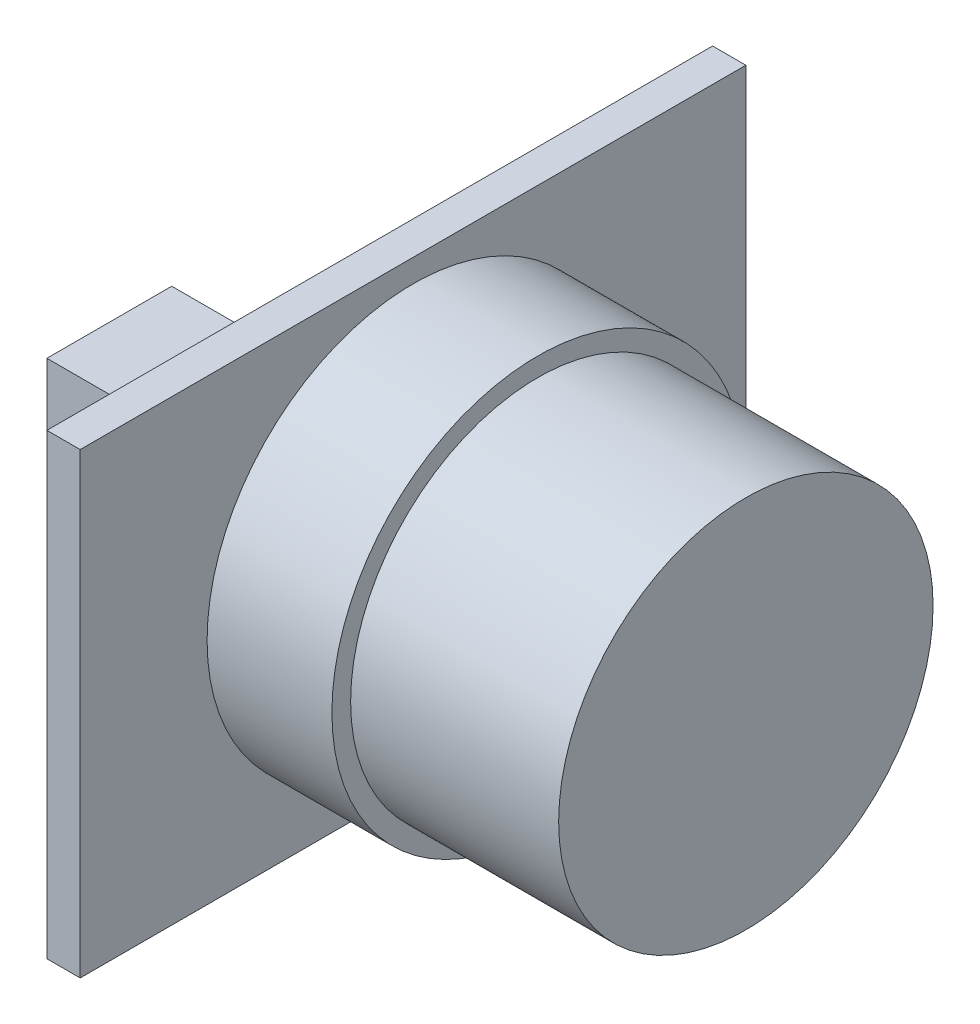
ISO-10303-21;
HEADER;
FILE_DESCRIPTION(('STEP AP214'),'2;1');
FILE_NAME('part.step','',(''),(''),'','','');
FILE_SCHEMA(('AUTOMOTIVE_DESIGN { 1 0 10303 214 1 1 1 1 }'));
ENDSEC;
DATA;
#1=APPLICATION_CONTEXT('core data for automotive mechanical design processes');
#2=APPLICATION_PROTOCOL_DEFINITION('international standard','automotive_design',2000,#1);
#3=PRODUCT_CONTEXT('',#1,'mechanical');
#4=PRODUCT('Part','Part','',(#3));
#5=PRODUCT_RELATED_PRODUCT_CATEGORY('part','',(#4));
#6=PRODUCT_DEFINITION_FORMATION('','',#4);
#7=PRODUCT_DEFINITION_CONTEXT('part definition',#1,'design');
#8=PRODUCT_DEFINITION('design','',#6,#7);
#9=PRODUCT_DEFINITION_SHAPE('','',#8);
#10=(LENGTH_UNIT() NAMED_UNIT(*) SI_UNIT(.MILLI.,.METRE.));
#11=(NAMED_UNIT(*) PLANE_ANGLE_UNIT() SI_UNIT($,.RADIAN.));
#12=(NAMED_UNIT(*) SI_UNIT($,.STERADIAN.) SOLID_ANGLE_UNIT());
#13=UNCERTAINTY_MEASURE_WITH_UNIT(LENGTH_MEASURE(1.E-05),#10,'distance_accuracy_value','');
#14=(GEOMETRIC_REPRESENTATION_CONTEXT(3) GLOBAL_UNCERTAINTY_ASSIGNED_CONTEXT((#13)) GLOBAL_UNIT_ASSIGNED_CONTEXT((#10,
#11,#12)) REPRESENTATION_CONTEXT('',''));
#15=CARTESIAN_POINT('',(0.,0.,0.));
#16=DIRECTION('',(0.,0.,1.));
#17=DIRECTION('',(1.,0.,0.));
#18=AXIS2_PLACEMENT_3D('',#15,#16,#17);
#19=CARTESIAN_POINT('',(29.2,-132.5,41.));
#20=DIRECTION('',(1.,0.,0.));
#21=DIRECTION('',(0.,0.,-1.));
#22=AXIS2_PLACEMENT_3D('',#19,#20,#21);
#23=PLANE('',#22);
#24=DIRECTION('',(0.,-1.,0.));
#25=VECTOR('',#24,1.);
#26=CARTESIAN_POINT('',(29.2,-132.5,9.));
#27=LINE('',#26,#25);
#28=CARTESIAN_POINT('',(29.2,-110.5,9.));
#29=VERTEX_POINT('',#28);
#30=CARTESIAN_POINT('',(29.2,-132.5,9.));
#31=VERTEX_POINT('',#30);
#32=EDGE_CURVE('E161',#29,#31,#27,.T.);
#33=ORIENTED_EDGE('',*,*,#32,.T.);
#34=DIRECTION('',(0.,0.,-1.));
#35=VECTOR('',#34,1.);
#36=CARTESIAN_POINT('',(29.2,-132.5,41.));
#37=LINE('',#36,#35);
#38=CARTESIAN_POINT('',(29.2,-132.5,41.));
#39=VERTEX_POINT('',#38);
#40=EDGE_CURVE('E165',#39,#31,#37,.T.);
#41=ORIENTED_EDGE('',*,*,#40,.F.);
#42=DIRECTION('',(0.,-1.,0.));
#43=VECTOR('',#42,1.);
#44=CARTESIAN_POINT('',(29.2,-132.5,41.));
#45=LINE('',#44,#43);
#46=CARTESIAN_POINT('',(29.2,-110.5,41.));
#47=VERTEX_POINT('',#46);
#48=EDGE_CURVE('E153',#47,#39,#45,.T.);
#49=ORIENTED_EDGE('',*,*,#48,.F.);
#50=DIRECTION('',(0.,0.,-1.));
#51=VECTOR('',#50,1.);
#52=CARTESIAN_POINT('',(29.2,-110.5,41.));
#53=LINE('',#52,#51);
#54=EDGE_CURVE('E166',#47,#29,#53,.T.);
#55=ORIENTED_EDGE('',*,*,#54,.T.);
#56=EDGE_LOOP('',(#33,#41,#49,#55));
#57=FACE_BOUND('',#56,.T.);
#58=DIRECTION('',(0.,1.,0.));
#59=VECTOR('',#58,1.);
#60=CARTESIAN_POINT('',(29.2,-119.5,35.));
#61=LINE('',#60,#59);
#62=CARTESIAN_POINT('',(29.2,-119.5,35.));
#63=VERTEX_POINT('',#62);
#64=CARTESIAN_POINT('',(29.2,-113.5,35.));
#65=VERTEX_POINT('',#64);
#66=EDGE_CURVE('E122',#63,#65,#61,.T.);
#67=ORIENTED_EDGE('',*,*,#66,.F.);
#68=DIRECTION('',(0.,0.,-1.));
#69=VECTOR('',#68,1.);
#70=CARTESIAN_POINT('',(29.2,-119.5,35.));
#71=LINE('',#70,#69);
#72=CARTESIAN_POINT('',(29.2,-119.5,29.));
#73=VERTEX_POINT('',#72);
#74=EDGE_CURVE('E381',#63,#73,#71,.T.);
#75=ORIENTED_EDGE('',*,*,#74,.T.);
#76=DIRECTION('',(0.,1.,0.));
#77=VECTOR('',#76,1.);
#78=CARTESIAN_POINT('',(29.2,-119.5,29.));
#79=LINE('',#78,#77);
#80=CARTESIAN_POINT('',(29.2,-113.5,29.));
#81=VERTEX_POINT('',#80);
#82=EDGE_CURVE('E135',#73,#81,#79,.T.);
#83=ORIENTED_EDGE('',*,*,#82,.T.);
#84=DIRECTION('',(0.,0.,-1.));
#85=VECTOR('',#84,1.);
#86=CARTESIAN_POINT('',(29.2,-113.5,35.));
#87=LINE('',#86,#85);
#88=EDGE_CURVE('E56',#65,#81,#87,.T.);
#89=ORIENTED_EDGE('',*,*,#88,.F.);
#90=EDGE_LOOP('',(#67,#75,#83,#89));
#91=FACE_BOUND('',#90,.T.);
#92=ADVANCED_FACE('F39',(#57,#91),#23,.F.);
#93=CARTESIAN_POINT('',(30.8,-132.5,41.));
#94=DIRECTION('',(-1.,0.,0.));
#95=DIRECTION('',(0.,0.,1.));
#96=AXIS2_PLACEMENT_3D('',#93,#94,#95);
#97=PLANE('',#96);
#98=CARTESIAN_POINT('',(30.8,-121.5,25.));
#99=DIRECTION('',(1.,0.,0.));
#100=DIRECTION('',(0.,0.,-1.));
#101=AXIS2_PLACEMENT_3D('',#98,#99,#100);
#102=CIRCLE('',#101,9.9);
#103=CARTESIAN_POINT('',(30.8,-121.5,15.1));
#104=VERTEX_POINT('',#103);
#105=EDGE_CURVE('E48',#104,#104,#102,.T.);
#106=ORIENTED_EDGE('',*,*,#105,.F.);
#107=EDGE_LOOP('',(#106));
#108=FACE_BOUND('',#107,.T.);
#109=DIRECTION('',(0.,1.,0.));
#110=VECTOR('',#109,1.);
#111=CARTESIAN_POINT('',(30.8,-132.5,9.));
#112=LINE('',#111,#110);
#113=CARTESIAN_POINT('',(30.8,-132.5,9.));
#114=VERTEX_POINT('',#113);
#115=CARTESIAN_POINT('',(30.8,-110.5,9.));
#116=VERTEX_POINT('',#115);
#117=EDGE_CURVE('E147',#114,#116,#112,.T.);
#118=ORIENTED_EDGE('',*,*,#117,.T.);
#119=DIRECTION('',(0.,0.,-1.));
#120=VECTOR('',#119,1.);
#121=CARTESIAN_POINT('',(30.8,-110.5,41.));
#122=LINE('',#121,#120);
#123=CARTESIAN_POINT('',(30.8,-110.5,41.));
#124=VERTEX_POINT('',#123);
#125=EDGE_CURVE('E43',#124,#116,#122,.T.);
#126=ORIENTED_EDGE('',*,*,#125,.F.);
#127=DIRECTION('',(0.,1.,0.));
#128=VECTOR('',#127,1.);
#129=CARTESIAN_POINT('',(30.8,-132.5,41.));
#130=LINE('',#129,#128);
#131=CARTESIAN_POINT('',(30.8,-132.5,41.));
#132=VERTEX_POINT('',#131);
#133=EDGE_CURVE('E150',#132,#124,#130,.T.);
#134=ORIENTED_EDGE('',*,*,#133,.F.);
#135=DIRECTION('',(0.,0.,-1.));
#136=VECTOR('',#135,1.);
#137=CARTESIAN_POINT('',(30.8,-132.5,41.));
#138=LINE('',#137,#136);
#139=EDGE_CURVE('E156',#132,#114,#138,.T.);
#140=ORIENTED_EDGE('',*,*,#139,.T.);
#141=EDGE_LOOP('',(#118,#126,#134,#140));
#142=FACE_BOUND('',#141,.T.);
#143=ADVANCED_FACE('F41',(#108,#142),#97,.F.);
#144=CARTESIAN_POINT('',(29.2,-110.5,41.));
#145=DIRECTION('',(0.,-1.,0.));
#146=DIRECTION('',(0.,0.,-1.));
#147=AXIS2_PLACEMENT_3D('',#144,#145,#146);
#148=PLANE('',#147);
#149=DIRECTION('',(-1.,0.,0.));
#150=VECTOR('',#149,1.);
#151=CARTESIAN_POINT('',(29.2,-110.5,9.));
#152=LINE('',#151,#150);
#153=EDGE_CURVE('E159',#116,#29,#152,.T.);
#154=ORIENTED_EDGE('',*,*,#153,.T.);
#155=ORIENTED_EDGE('',*,*,#54,.F.);
#156=DIRECTION('',(-1.,0.,0.));
#157=VECTOR('',#156,1.);
#158=CARTESIAN_POINT('',(29.2,-110.5,41.));
#159=LINE('',#158,#157);
#160=EDGE_CURVE('E94',#124,#47,#159,.T.);
#161=ORIENTED_EDGE('',*,*,#160,.F.);
#162=ORIENTED_EDGE('',*,*,#125,.T.);
#163=EDGE_LOOP('',(#154,#155,#161,#162));
#164=FACE_BOUND('',#163,.T.);
#165=ADVANCED_FACE('F172',(#164),#148,.F.);
#166=CARTESIAN_POINT('',(29.2,-132.5,41.));
#167=DIRECTION('',(0.,1.,0.));
#168=DIRECTION('',(0.,0.,1.));
#169=AXIS2_PLACEMENT_3D('',#166,#167,#168);
#170=PLANE('',#169);
#171=DIRECTION('',(1.,0.,0.));
#172=VECTOR('',#171,1.);
#173=CARTESIAN_POINT('',(29.2,-132.5,9.));
#174=LINE('',#173,#172);
#175=EDGE_CURVE('E86',#31,#114,#174,.T.);
#176=ORIENTED_EDGE('',*,*,#175,.T.);
#177=ORIENTED_EDGE('',*,*,#139,.F.);
#178=DIRECTION('',(1.,0.,0.));
#179=VECTOR('',#178,1.);
#180=CARTESIAN_POINT('',(29.2,-132.5,41.));
#181=LINE('',#180,#179);
#182=EDGE_CURVE('E65',#39,#132,#181,.T.);
#183=ORIENTED_EDGE('',*,*,#182,.F.);
#184=ORIENTED_EDGE('',*,*,#40,.T.);
#185=EDGE_LOOP('',(#176,#177,#183,#184));
#186=FACE_BOUND('',#185,.T.);
#187=ADVANCED_FACE('F179',(#186),#170,.F.);
#188=CARTESIAN_POINT('',(0.,0.,41.));
#189=DIRECTION('',(0.,0.,-1.));
#190=DIRECTION('',(-1.,0.,0.));
#191=AXIS2_PLACEMENT_3D('',#188,#189,#190);
#192=PLANE('',#191);
#193=ORIENTED_EDGE('',*,*,#133,.T.);
#194=ORIENTED_EDGE('',*,*,#160,.T.);
#195=ORIENTED_EDGE('',*,*,#48,.T.);
#196=ORIENTED_EDGE('',*,*,#182,.T.);
#197=EDGE_LOOP('',(#193,#194,#195,#196));
#198=FACE_BOUND('',#197,.T.);
#199=ADVANCED_FACE('F180',(#198),#192,.F.);
#200=CARTESIAN_POINT('',(0.,0.,9.));
#201=DIRECTION('',(0.,0.,-1.));
#202=DIRECTION('',(-1.,0.,0.));
#203=AXIS2_PLACEMENT_3D('',#200,#201,#202);
#204=PLANE('',#203);
#205=ORIENTED_EDGE('',*,*,#117,.F.);
#206=ORIENTED_EDGE('',*,*,#175,.F.);
#207=ORIENTED_EDGE('',*,*,#32,.F.);
#208=ORIENTED_EDGE('',*,*,#153,.F.);
#209=EDGE_LOOP('',(#205,#206,#207,#208));
#210=FACE_BOUND('',#209,.T.);
#211=ADVANCED_FACE('F177',(#210),#204,.T.);
#212=CARTESIAN_POINT('',(36.8,-121.5,25.));
#213=DIRECTION('',(-1.,0.,0.));
#214=DIRECTION('',(0.,0.,1.));
#215=AXIS2_PLACEMENT_3D('',#212,#213,#214);
#216=CYLINDRICAL_SURFACE('',#215,9.9);
#217=CARTESIAN_POINT('',(36.8,-121.5,25.));
#218=DIRECTION('',(1.,0.,0.));
#219=DIRECTION('',(0.,0.,-1.));
#220=AXIS2_PLACEMENT_3D('',#217,#218,#219);
#221=CIRCLE('',#220,9.9);
#222=CARTESIAN_POINT('',(36.8,-121.5,15.1));
#223=VERTEX_POINT('',#222);
#224=EDGE_CURVE('E139',#223,#223,#221,.T.);
#225=ORIENTED_EDGE('',*,*,#224,.F.);
#226=EDGE_LOOP('',(#225));
#227=FACE_BOUND('',#226,.T.);
#228=ORIENTED_EDGE('',*,*,#105,.T.);
#229=EDGE_LOOP('',(#228));
#230=FACE_BOUND('',#229,.T.);
#231=ADVANCED_FACE('F187',(#227,#230),#216,.T.);
#232=CARTESIAN_POINT('',(36.8,-121.5,25.));
#233=DIRECTION('',(1.,0.,0.));
#234=DIRECTION('',(0.,0.,-1.));
#235=AXIS2_PLACEMENT_3D('',#232,#233,#234);
#236=PLANE('',#235);
#237=CARTESIAN_POINT('',(36.8,-121.5,25.));
#238=DIRECTION('',(1.,0.,0.));
#239=DIRECTION('',(0.,0.,-1.));
#240=AXIS2_PLACEMENT_3D('',#237,#238,#239);
#241=CIRCLE('',#240,9.);
#242=CARTESIAN_POINT('',(36.8,-121.5,16.));
#243=VERTEX_POINT('',#242);
#244=EDGE_CURVE('E11',#243,#243,#241,.T.);
#245=ORIENTED_EDGE('',*,*,#244,.F.);
#246=EDGE_LOOP('',(#245));
#247=FACE_BOUND('',#246,.T.);
#248=ORIENTED_EDGE('',*,*,#224,.T.);
#249=EDGE_LOOP('',(#248));
#250=FACE_BOUND('',#249,.T.);
#251=ADVANCED_FACE('F225',(#247,#250),#236,.T.);
#252=CARTESIAN_POINT('',(46.8,-121.5,25.));
#253=DIRECTION('',(-1.,0.,0.));
#254=DIRECTION('',(0.,0.,1.));
#255=AXIS2_PLACEMENT_3D('',#252,#253,#254);
#256=CYLINDRICAL_SURFACE('',#255,9.);
#257=CARTESIAN_POINT('',(46.8,-121.5,25.));
#258=DIRECTION('',(1.,0.,0.));
#259=DIRECTION('',(0.,0.,-1.));
#260=AXIS2_PLACEMENT_3D('',#257,#258,#259);
#261=CIRCLE('',#260,9.);
#262=CARTESIAN_POINT('',(46.8,-121.5,16.));
#263=VERTEX_POINT('',#262);
#264=EDGE_CURVE('E136',#263,#263,#261,.T.);
#265=ORIENTED_EDGE('',*,*,#264,.F.);
#266=EDGE_LOOP('',(#265));
#267=FACE_BOUND('',#266,.T.);
#268=ORIENTED_EDGE('',*,*,#244,.T.);
#269=EDGE_LOOP('',(#268));
#270=FACE_BOUND('',#269,.T.);
#271=ADVANCED_FACE('F236',(#267,#270),#256,.T.);
#272=CARTESIAN_POINT('',(46.8,-121.5,25.));
#273=DIRECTION('',(1.,0.,0.));
#274=DIRECTION('',(0.,0.,-1.));
#275=AXIS2_PLACEMENT_3D('',#272,#273,#274);
#276=PLANE('',#275);
#277=ORIENTED_EDGE('',*,*,#264,.T.);
#278=EDGE_LOOP('',(#277));
#279=FACE_BOUND('',#278,.T.);
#280=ADVANCED_FACE('F241',(#279),#276,.T.);
#281=CARTESIAN_POINT('',(23.2,-113.5,35.));
#282=DIRECTION('',(0.,-1.,0.));
#283=DIRECTION('',(0.,0.,-1.));
#284=AXIS2_PLACEMENT_3D('',#281,#282,#283);
#285=PLANE('',#284);
#286=DIRECTION('',(-1.,0.,0.));
#287=VECTOR('',#286,1.);
#288=CARTESIAN_POINT('',(23.2,-113.5,29.));
#289=LINE('',#288,#287);
#290=CARTESIAN_POINT('',(23.2,-113.5,29.));
#291=VERTEX_POINT('',#290);
#292=EDGE_CURVE('E379',#81,#291,#289,.T.);
#293=ORIENTED_EDGE('',*,*,#292,.T.);
#294=DIRECTION('',(0.,0.,-1.));
#295=VECTOR('',#294,1.);
#296=CARTESIAN_POINT('',(23.2,-113.5,35.));
#297=LINE('',#296,#295);
#298=CARTESIAN_POINT('',(23.2,-113.5,35.));
#299=VERTEX_POINT('',#298);
#300=EDGE_CURVE('E118',#299,#291,#297,.T.);
#301=ORIENTED_EDGE('',*,*,#300,.F.);
#302=DIRECTION('',(-1.,0.,0.));
#303=VECTOR('',#302,1.);
#304=CARTESIAN_POINT('',(23.2,-113.5,35.));
#305=LINE('',#304,#303);
#306=EDGE_CURVE('E114',#65,#299,#305,.T.);
#307=ORIENTED_EDGE('',*,*,#306,.F.);
#308=ORIENTED_EDGE('',*,*,#88,.T.);
#309=EDGE_LOOP('',(#293,#301,#307,#308));
#310=FACE_BOUND('',#309,.T.);
#311=ADVANCED_FACE('F116',(#310),#285,.F.);
#312=CARTESIAN_POINT('',(23.2,-119.5,35.));
#313=DIRECTION('',(1.,0.,0.));
#314=DIRECTION('',(0.,0.,-1.));
#315=AXIS2_PLACEMENT_3D('',#312,#313,#314);
#316=PLANE('',#315);
#317=DIRECTION('',(0.,-1.,0.));
#318=VECTOR('',#317,1.);
#319=CARTESIAN_POINT('',(23.2,-119.5,29.));
#320=LINE('',#319,#318);
#321=CARTESIAN_POINT('',(23.2,-119.5,29.));
#322=VERTEX_POINT('',#321);
#323=EDGE_CURVE('E376',#291,#322,#320,.T.);
#324=ORIENTED_EDGE('',*,*,#323,.T.);
#325=DIRECTION('',(0.,0.,-1.));
#326=VECTOR('',#325,1.);
#327=CARTESIAN_POINT('',(23.2,-119.5,35.));
#328=LINE('',#327,#326);
#329=CARTESIAN_POINT('',(23.2,-119.5,35.));
#330=VERTEX_POINT('',#329);
#331=EDGE_CURVE('E141',#330,#322,#328,.T.);
#332=ORIENTED_EDGE('',*,*,#331,.F.);
#333=DIRECTION('',(0.,-1.,0.));
#334=VECTOR('',#333,1.);
#335=CARTESIAN_POINT('',(23.2,-119.5,35.));
#336=LINE('',#335,#334);
#337=EDGE_CURVE('E121',#299,#330,#336,.T.);
#338=ORIENTED_EDGE('',*,*,#337,.F.);
#339=ORIENTED_EDGE('',*,*,#300,.T.);
#340=EDGE_LOOP('',(#324,#332,#338,#339));
#341=FACE_BOUND('',#340,.T.);
#342=ADVANCED_FACE('F292',(#341),#316,.F.);
#343=CARTESIAN_POINT('',(23.2,-119.5,35.));
#344=DIRECTION('',(0.,1.,0.));
#345=DIRECTION('',(0.,0.,1.));
#346=AXIS2_PLACEMENT_3D('',#343,#344,#345);
#347=PLANE('',#346);
#348=DIRECTION('',(1.,0.,0.));
#349=VECTOR('',#348,1.);
#350=CARTESIAN_POINT('',(23.2,-119.5,29.));
#351=LINE('',#350,#349);
#352=EDGE_CURVE('E131',#322,#73,#351,.T.);
#353=ORIENTED_EDGE('',*,*,#352,.T.);
#354=ORIENTED_EDGE('',*,*,#74,.F.);
#355=DIRECTION('',(1.,0.,0.));
#356=VECTOR('',#355,1.);
#357=CARTESIAN_POINT('',(23.2,-119.5,35.));
#358=LINE('',#357,#356);
#359=EDGE_CURVE('E127',#330,#63,#358,.T.);
#360=ORIENTED_EDGE('',*,*,#359,.F.);
#361=ORIENTED_EDGE('',*,*,#331,.T.);
#362=EDGE_LOOP('',(#353,#354,#360,#361));
#363=FACE_BOUND('',#362,.T.);
#364=ADVANCED_FACE('F283',(#363),#347,.F.);
#365=CARTESIAN_POINT('',(0.,0.,35.));
#366=DIRECTION('',(0.,0.,-1.));
#367=DIRECTION('',(-1.,0.,0.));
#368=AXIS2_PLACEMENT_3D('',#365,#366,#367);
#369=PLANE('',#368);
#370=ORIENTED_EDGE('',*,*,#66,.T.);
#371=ORIENTED_EDGE('',*,*,#306,.T.);
#372=ORIENTED_EDGE('',*,*,#337,.T.);
#373=ORIENTED_EDGE('',*,*,#359,.T.);
#374=EDGE_LOOP('',(#370,#371,#372,#373));
#375=FACE_BOUND('',#374,.T.);
#376=ADVANCED_FACE('F125',(#375),#369,.F.);
#377=CARTESIAN_POINT('',(0.,0.,29.));
#378=DIRECTION('',(0.,0.,-1.));
#379=DIRECTION('',(-1.,0.,0.));
#380=AXIS2_PLACEMENT_3D('',#377,#378,#379);
#381=PLANE('',#380);
#382=ORIENTED_EDGE('',*,*,#82,.F.);
#383=ORIENTED_EDGE('',*,*,#352,.F.);
#384=ORIENTED_EDGE('',*,*,#323,.F.);
#385=ORIENTED_EDGE('',*,*,#292,.F.);
#386=EDGE_LOOP('',(#382,#383,#384,#385));
#387=FACE_BOUND('',#386,.T.);
#388=ADVANCED_FACE('F269',(#387),#381,.T.);
#389=CLOSED_SHELL('',(#92,#143,#165,#187,#199,#211,#231,#251,#271,#280,#311,#342,#364,#376,#388));
#390=MANIFOLD_SOLID_BREP('B2',#389);
#391=ADVANCED_BREP_SHAPE_REPRESENTATION('',(#18,#390),#14);
#392=SHAPE_DEFINITION_REPRESENTATION(#9,#391);
ENDSEC;
END-ISO-10303-21;
